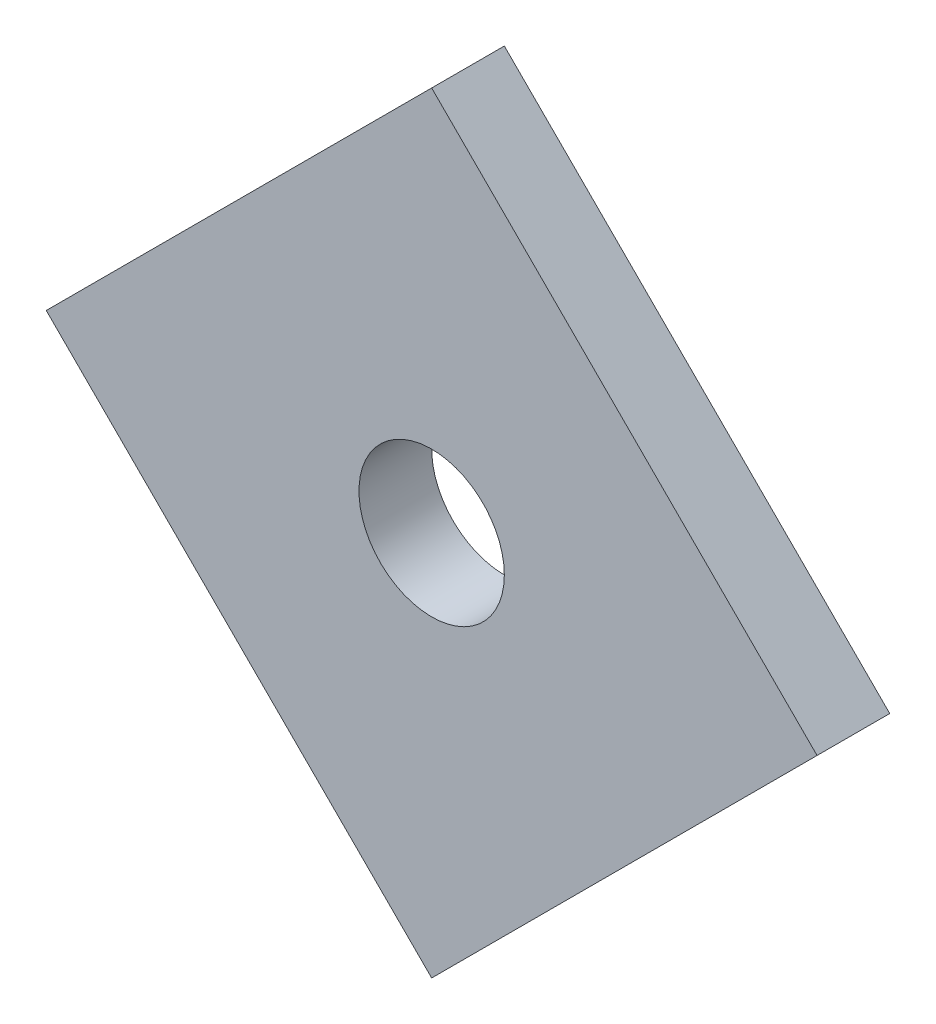
ISO-10303-21;
HEADER;
FILE_DESCRIPTION(('STEP AP214'),'2;1');
FILE_NAME('part.step','',(''),(''),'','','');
FILE_SCHEMA(('AUTOMOTIVE_DESIGN { 1 0 10303 214 1 1 1 1 }'));
ENDSEC;
DATA;
#1=APPLICATION_CONTEXT('core data for automotive mechanical design processes');
#2=APPLICATION_PROTOCOL_DEFINITION('international standard','automotive_design',2000,#1);
#3=PRODUCT_CONTEXT('',#1,'mechanical');
#4=PRODUCT('Part','Part','',(#3));
#5=PRODUCT_RELATED_PRODUCT_CATEGORY('part','',(#4));
#6=PRODUCT_DEFINITION_FORMATION('','',#4);
#7=PRODUCT_DEFINITION_CONTEXT('part definition',#1,'design');
#8=PRODUCT_DEFINITION('design','',#6,#7);
#9=PRODUCT_DEFINITION_SHAPE('','',#8);
#10=(LENGTH_UNIT() NAMED_UNIT(*) SI_UNIT(.MILLI.,.METRE.));
#11=(NAMED_UNIT(*) PLANE_ANGLE_UNIT() SI_UNIT($,.RADIAN.));
#12=(NAMED_UNIT(*) SI_UNIT($,.STERADIAN.) SOLID_ANGLE_UNIT());
#13=UNCERTAINTY_MEASURE_WITH_UNIT(LENGTH_MEASURE(1.E-05),#10,'distance_accuracy_value','');
#14=(GEOMETRIC_REPRESENTATION_CONTEXT(3) GLOBAL_UNCERTAINTY_ASSIGNED_CONTEXT((#13)) GLOBAL_UNIT_ASSIGNED_CONTEXT((#10,
#11,#12)) REPRESENTATION_CONTEXT('',''));
#15=CARTESIAN_POINT('',(0.,0.,0.));
#16=DIRECTION('',(0.,0.,1.));
#17=DIRECTION('',(1.,0.,0.));
#18=AXIS2_PLACEMENT_3D('',#15,#16,#17);
#19=CARTESIAN_POINT('',(0.,0.,10.));
#20=DIRECTION('',(0.,0.,-1.));
#21=DIRECTION('',(-1.,0.,0.));
#22=AXIS2_PLACEMENT_3D('',#19,#20,#21);
#23=PLANE('',#22);
#24=DIRECTION('',(0.707106781186547,-0.707106781186548,0.));
#25=VECTOR('',#24,1.);
#26=CARTESIAN_POINT('',(0.,-53.0330085889904,10.));
#27=LINE('',#26,#25);
#28=CARTESIAN_POINT('',(-53.0330085889903,0.,10.));
#29=VERTEX_POINT('',#28);
#30=CARTESIAN_POINT('',(0.,-53.0330085889904,10.));
#31=VERTEX_POINT('',#30);
#32=EDGE_CURVE('E92',#29,#31,#27,.T.);
#33=ORIENTED_EDGE('',*,*,#32,.T.);
#34=DIRECTION('',(0.707106781186548,0.707106781186548,0.));
#35=VECTOR('',#34,1.);
#36=CARTESIAN_POINT('',(53.0330085889911,6.52256026967279E-13,10.));
#37=LINE('',#36,#35);
#38=CARTESIAN_POINT('',(53.0330085889911,6.52256026967279E-13,10.));
#39=VERTEX_POINT('',#38);
#40=EDGE_CURVE('E87',#31,#39,#37,.T.);
#41=ORIENTED_EDGE('',*,*,#40,.T.);
#42=DIRECTION('',(-0.707106781186548,0.707106781186548,0.));
#43=VECTOR('',#42,1.);
#44=CARTESIAN_POINT('',(7.42461647718073E-13,53.033008588991,10.));
#45=LINE('',#44,#43);
#46=CARTESIAN_POINT('',(7.42461647718073E-13,53.033008588991,10.));
#47=VERTEX_POINT('',#46);
#48=EDGE_CURVE('E90',#39,#47,#45,.T.);
#49=ORIENTED_EDGE('',*,*,#48,.T.);
#50=DIRECTION('',(-0.707106781186548,-0.707106781186548,0.));
#51=VECTOR('',#50,1.);
#52=CARTESIAN_POINT('',(-53.0330085889903,0.,10.));
#53=LINE('',#52,#51);
#54=EDGE_CURVE('E57',#47,#29,#53,.T.);
#55=ORIENTED_EDGE('',*,*,#54,.T.);
#56=EDGE_LOOP('',(#33,#41,#49,#55));
#57=FACE_BOUND('',#56,.T.);
#58=CARTESIAN_POINT('',(0.,0.,10.));
#59=DIRECTION('',(0.,0.,1.));
#60=DIRECTION('',(1.,0.,0.));
#61=AXIS2_PLACEMENT_3D('',#58,#59,#60);
#62=CIRCLE('',#61,10.);
#63=CARTESIAN_POINT('',(10.,0.,10.));
#64=VERTEX_POINT('',#63);
#65=EDGE_CURVE('E112',#64,#64,#62,.T.);
#66=ORIENTED_EDGE('',*,*,#65,.F.);
#67=EDGE_LOOP('',(#66));
#68=FACE_BOUND('',#67,.T.);
#69=ADVANCED_FACE('F39',(#57,#68),#23,.F.);
#70=CARTESIAN_POINT('',(0.,0.,0.));
#71=DIRECTION('',(0.,0.,-1.));
#72=DIRECTION('',(-1.,0.,0.));
#73=AXIS2_PLACEMENT_3D('',#70,#71,#72);
#74=PLANE('',#73);
#75=DIRECTION('',(0.707106781186547,-0.707106781186548,0.));
#76=VECTOR('',#75,1.);
#77=CARTESIAN_POINT('',(0.,-53.0330085889904,0.));
#78=LINE('',#77,#76);
#79=CARTESIAN_POINT('',(-53.0330085889903,0.,0.));
#80=VERTEX_POINT('',#79);
#81=CARTESIAN_POINT('',(0.,-53.0330085889904,0.));
#82=VERTEX_POINT('',#81);
#83=EDGE_CURVE('E108',#80,#82,#78,.T.);
#84=ORIENTED_EDGE('',*,*,#83,.F.);
#85=DIRECTION('',(-0.707106781186548,-0.707106781186548,0.));
#86=VECTOR('',#85,1.);
#87=CARTESIAN_POINT('',(-53.0330085889903,0.,0.));
#88=LINE('',#87,#86);
#89=CARTESIAN_POINT('',(7.42461647718073E-13,53.033008588991,0.));
#90=VERTEX_POINT('',#89);
#91=EDGE_CURVE('E80',#90,#80,#88,.T.);
#92=ORIENTED_EDGE('',*,*,#91,.F.);
#93=DIRECTION('',(-0.707106781186548,0.707106781186548,0.));
#94=VECTOR('',#93,1.);
#95=CARTESIAN_POINT('',(7.42461647718073E-13,53.033008588991,0.));
#96=LINE('',#95,#94);
#97=CARTESIAN_POINT('',(53.0330085889911,6.52256026967279E-13,0.));
#98=VERTEX_POINT('',#97);
#99=EDGE_CURVE('E74',#98,#90,#96,.T.);
#100=ORIENTED_EDGE('',*,*,#99,.F.);
#101=DIRECTION('',(0.707106781186548,0.707106781186548,0.));
#102=VECTOR('',#101,1.);
#103=CARTESIAN_POINT('',(53.0330085889911,6.52256026967279E-13,0.));
#104=LINE('',#103,#102);
#105=EDGE_CURVE('E97',#82,#98,#104,.T.);
#106=ORIENTED_EDGE('',*,*,#105,.F.);
#107=EDGE_LOOP('',(#84,#92,#100,#106));
#108=FACE_BOUND('',#107,.T.);
#109=CARTESIAN_POINT('',(0.,0.,0.));
#110=DIRECTION('',(0.,0.,1.));
#111=DIRECTION('',(1.,0.,0.));
#112=AXIS2_PLACEMENT_3D('',#109,#110,#111);
#113=CIRCLE('',#112,10.);
#114=CARTESIAN_POINT('',(10.,0.,0.));
#115=VERTEX_POINT('',#114);
#116=EDGE_CURVE('E130',#115,#115,#113,.T.);
#117=ORIENTED_EDGE('',*,*,#116,.T.);
#118=EDGE_LOOP('',(#117));
#119=FACE_BOUND('',#118,.T.);
#120=ADVANCED_FACE('F125',(#108,#119),#74,.T.);
#121=CARTESIAN_POINT('',(0.,-53.0330085889904,10.));
#122=DIRECTION('',(0.707106781186548,0.707106781186547,0.));
#123=DIRECTION('',(-0.707106781186547,0.707106781186548,0.));
#124=AXIS2_PLACEMENT_3D('',#121,#122,#123);
#125=PLANE('',#124);
#126=ORIENTED_EDGE('',*,*,#83,.T.);
#127=DIRECTION('',(0.,0.,-1.));
#128=VECTOR('',#127,1.);
#129=CARTESIAN_POINT('',(0.,-53.0330085889904,10.));
#130=LINE('',#129,#128);
#131=EDGE_CURVE('E11',#31,#82,#130,.T.);
#132=ORIENTED_EDGE('',*,*,#131,.F.);
#133=ORIENTED_EDGE('',*,*,#32,.F.);
#134=DIRECTION('',(0.,0.,-1.));
#135=VECTOR('',#134,1.);
#136=CARTESIAN_POINT('',(-53.0330085889903,0.,10.));
#137=LINE('',#136,#135);
#138=EDGE_CURVE('E104',#29,#80,#137,.T.);
#139=ORIENTED_EDGE('',*,*,#138,.T.);
#140=EDGE_LOOP('',(#126,#132,#133,#139));
#141=FACE_BOUND('',#140,.T.);
#142=ADVANCED_FACE('F41',(#141),#125,.F.);
#143=CARTESIAN_POINT('',(53.0330085889911,6.52256026967279E-13,10.));
#144=DIRECTION('',(-0.707106781186548,0.707106781186548,0.));
#145=DIRECTION('',(-0.707106781186548,-0.707106781186548,0.));
#146=AXIS2_PLACEMENT_3D('',#143,#144,#145);
#147=PLANE('',#146);
#148=ORIENTED_EDGE('',*,*,#105,.T.);
#149=DIRECTION('',(0.,0.,-1.));
#150=VECTOR('',#149,1.);
#151=CARTESIAN_POINT('',(53.0330085889911,6.52256026967279E-13,10.));
#152=LINE('',#151,#150);
#153=EDGE_CURVE('E49',#39,#98,#152,.T.);
#154=ORIENTED_EDGE('',*,*,#153,.F.);
#155=ORIENTED_EDGE('',*,*,#40,.F.);
#156=ORIENTED_EDGE('',*,*,#131,.T.);
#157=EDGE_LOOP('',(#148,#154,#155,#156));
#158=FACE_BOUND('',#157,.T.);
#159=ADVANCED_FACE('F96',(#158),#147,.F.);
#160=CARTESIAN_POINT('',(7.42461647718073E-13,53.033008588991,10.));
#161=DIRECTION('',(-0.707106781186548,-0.707106781186548,0.));
#162=DIRECTION('',(0.707106781186548,-0.707106781186548,0.));
#163=AXIS2_PLACEMENT_3D('',#160,#161,#162);
#164=PLANE('',#163);
#165=ORIENTED_EDGE('',*,*,#99,.T.);
#166=DIRECTION('',(0.,0.,-1.));
#167=VECTOR('',#166,1.);
#168=CARTESIAN_POINT('',(7.42461647718073E-13,53.033008588991,10.));
#169=LINE('',#168,#167);
#170=EDGE_CURVE('E99',#47,#90,#169,.T.);
#171=ORIENTED_EDGE('',*,*,#170,.F.);
#172=ORIENTED_EDGE('',*,*,#48,.F.);
#173=ORIENTED_EDGE('',*,*,#153,.T.);
#174=EDGE_LOOP('',(#165,#171,#172,#173));
#175=FACE_BOUND('',#174,.T.);
#176=ADVANCED_FACE('F100',(#175),#164,.F.);
#177=CARTESIAN_POINT('',(-53.0330085889903,0.,10.));
#178=DIRECTION('',(0.707106781186548,-0.707106781186548,0.));
#179=DIRECTION('',(0.707106781186548,0.707106781186548,0.));
#180=AXIS2_PLACEMENT_3D('',#177,#178,#179);
#181=PLANE('',#180);
#182=ORIENTED_EDGE('',*,*,#91,.T.);
#183=ORIENTED_EDGE('',*,*,#138,.F.);
#184=ORIENTED_EDGE('',*,*,#54,.F.);
#185=ORIENTED_EDGE('',*,*,#170,.T.);
#186=EDGE_LOOP('',(#182,#183,#184,#185));
#187=FACE_BOUND('',#186,.T.);
#188=ADVANCED_FACE('F122',(#187),#181,.F.);
#189=CARTESIAN_POINT('',(0.,0.,10.));
#190=DIRECTION('',(0.,0.,-1.));
#191=DIRECTION('',(-1.,0.,0.));
#192=AXIS2_PLACEMENT_3D('',#189,#190,#191);
#193=CYLINDRICAL_SURFACE('',#192,10.);
#194=ORIENTED_EDGE('',*,*,#65,.T.);
#195=EDGE_LOOP('',(#194));
#196=FACE_BOUND('',#195,.T.);
#197=ORIENTED_EDGE('',*,*,#116,.F.);
#198=EDGE_LOOP('',(#197));
#199=FACE_BOUND('',#198,.T.);
#200=ADVANCED_FACE('F138',(#196,#199),#193,.F.);
#201=CLOSED_SHELL('',(#69,#120,#142,#159,#176,#188,#200));
#202=MANIFOLD_SOLID_BREP('B2',#201);
#203=ADVANCED_BREP_SHAPE_REPRESENTATION('',(#18,#202),#14);
#204=SHAPE_DEFINITION_REPRESENTATION(#9,#203);
ENDSEC;
END-ISO-10303-21;
